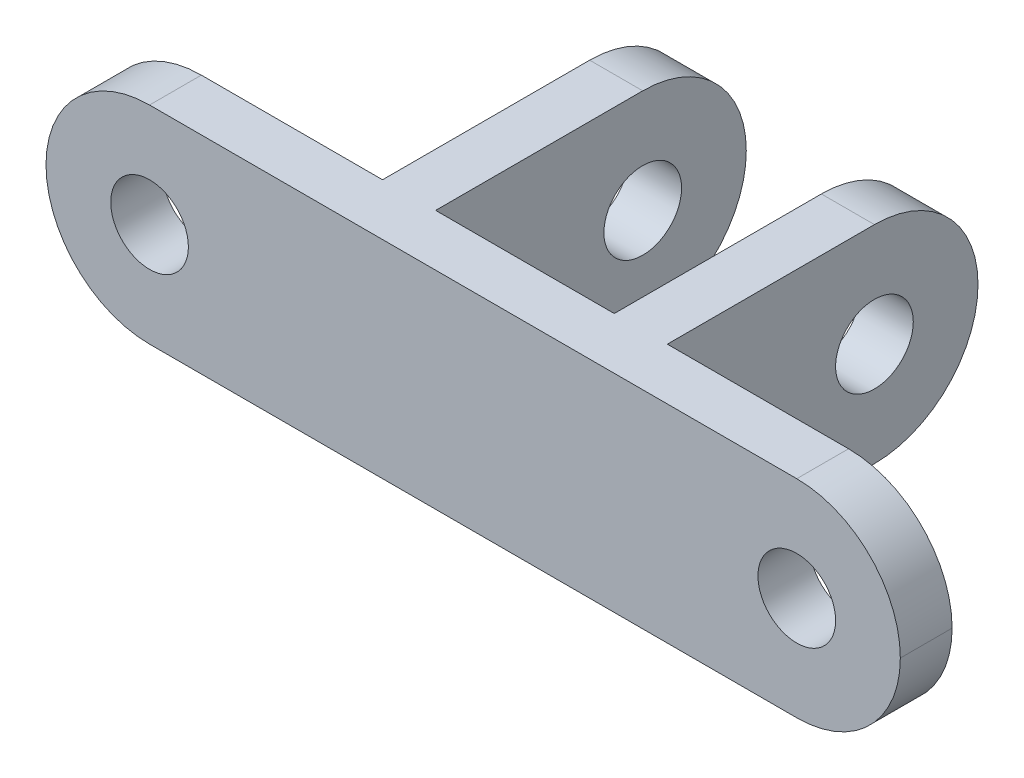
ISO-10303-21;
HEADER;
FILE_DESCRIPTION(('STEP AP214'),'2;1');
FILE_NAME('part.step','',(''),(''),'','','');
FILE_SCHEMA(('AUTOMOTIVE_DESIGN { 1 0 10303 214 1 1 1 1 }'));
ENDSEC;
DATA;
#1=APPLICATION_CONTEXT('core data for automotive mechanical design processes');
#2=APPLICATION_PROTOCOL_DEFINITION('international standard','automotive_design',2000,#1);
#3=PRODUCT_CONTEXT('',#1,'mechanical');
#4=PRODUCT('Part','Part','',(#3));
#5=PRODUCT_RELATED_PRODUCT_CATEGORY('part','',(#4));
#6=PRODUCT_DEFINITION_FORMATION('','',#4);
#7=PRODUCT_DEFINITION_CONTEXT('part definition',#1,'design');
#8=PRODUCT_DEFINITION('design','',#6,#7);
#9=PRODUCT_DEFINITION_SHAPE('','',#8);
#10=(LENGTH_UNIT() NAMED_UNIT(*) SI_UNIT(.MILLI.,.METRE.));
#11=(NAMED_UNIT(*) PLANE_ANGLE_UNIT() SI_UNIT($,.RADIAN.));
#12=(NAMED_UNIT(*) SI_UNIT($,.STERADIAN.) SOLID_ANGLE_UNIT());
#13=UNCERTAINTY_MEASURE_WITH_UNIT(LENGTH_MEASURE(1.E-05),#10,'distance_accuracy_value','');
#14=(GEOMETRIC_REPRESENTATION_CONTEXT(3) GLOBAL_UNCERTAINTY_ASSIGNED_CONTEXT((#13)) GLOBAL_UNIT_ASSIGNED_CONTEXT((#10,
#11,#12)) REPRESENTATION_CONTEXT('',''));
#15=CARTESIAN_POINT('',(0.,0.,0.));
#16=DIRECTION('',(0.,0.,1.));
#17=DIRECTION('',(1.,0.,0.));
#18=AXIS2_PLACEMENT_3D('',#15,#16,#17);
#19=CARTESIAN_POINT('',(-16.5,8.,7.));
#20=DIRECTION('',(0.,0.,-1.));
#21=DIRECTION('',(-1.,0.,0.));
#22=AXIS2_PLACEMENT_3D('',#19,#20,#21);
#23=PLANE('',#22);
#24=CARTESIAN_POINT('',(-12.5,4.,7.));
#25=DIRECTION('',(0.,0.,1.));
#26=DIRECTION('',(1.,0.,0.));
#27=AXIS2_PLACEMENT_3D('',#24,#25,#26);
#28=CIRCLE('',#27,1.5);
#29=CARTESIAN_POINT('',(-11.,4.,7.));
#30=VERTEX_POINT('',#29);
#31=EDGE_CURVE('E288',#30,#30,#28,.T.);
#32=ORIENTED_EDGE('',*,*,#31,.F.);
#33=EDGE_LOOP('',(#32));
#34=FACE_BOUND('',#33,.T.);
#35=CARTESIAN_POINT('',(12.5,4.,7.));
#36=DIRECTION('',(0.,0.,1.));
#37=DIRECTION('',(1.,0.,0.));
#38=AXIS2_PLACEMENT_3D('',#35,#36,#37);
#39=CIRCLE('',#38,1.5);
#40=CARTESIAN_POINT('',(14.,4.,7.));
#41=VERTEX_POINT('',#40);
#42=EDGE_CURVE('E277',#41,#41,#39,.T.);
#43=ORIENTED_EDGE('',*,*,#42,.F.);
#44=EDGE_LOOP('',(#43));
#45=FACE_BOUND('',#44,.T.);
#46=DIRECTION('',(1.,0.,0.));
#47=VECTOR('',#46,1.);
#48=CARTESIAN_POINT('',(-16.5,0.,7.));
#49=LINE('',#48,#47);
#50=CARTESIAN_POINT('',(-12.5,0.,7.));
#51=VERTEX_POINT('',#50);
#52=CARTESIAN_POINT('',(12.5,0.,7.));
#53=VERTEX_POINT('',#52);
#54=EDGE_CURVE('E211',#51,#53,#49,.T.);
#55=ORIENTED_EDGE('',*,*,#54,.T.);
#56=CARTESIAN_POINT('',(12.5,4.,7.));
#57=DIRECTION('',(0.,0.,-1.));
#58=DIRECTION('',(-1.,0.,0.));
#59=AXIS2_PLACEMENT_3D('',#56,#57,#58);
#60=CIRCLE('',#59,4.);
#61=CARTESIAN_POINT('',(16.5,4.,7.));
#62=VERTEX_POINT('',#61);
#63=EDGE_CURVE('E232',#53,#62,#60,.F.);
#64=ORIENTED_EDGE('',*,*,#63,.T.);
#65=CARTESIAN_POINT('',(12.5,4.,7.));
#66=DIRECTION('',(0.,0.,-1.));
#67=DIRECTION('',(-1.,0.,0.));
#68=AXIS2_PLACEMENT_3D('',#65,#66,#67);
#69=CIRCLE('',#68,4.);
#70=CARTESIAN_POINT('',(12.5,8.,7.));
#71=VERTEX_POINT('',#70);
#72=EDGE_CURVE('E230',#62,#71,#69,.F.);
#73=ORIENTED_EDGE('',*,*,#72,.T.);
#74=DIRECTION('',(1.,0.,0.));
#75=VECTOR('',#74,1.);
#76=CARTESIAN_POINT('',(-16.5,8.,7.));
#77=LINE('',#76,#75);
#78=CARTESIAN_POINT('',(-12.5,8.,7.));
#79=VERTEX_POINT('',#78);
#80=EDGE_CURVE('E212',#79,#71,#77,.T.);
#81=ORIENTED_EDGE('',*,*,#80,.F.);
#82=CARTESIAN_POINT('',(-12.5,4.,7.));
#83=DIRECTION('',(0.,0.,-1.));
#84=DIRECTION('',(-1.,0.,0.));
#85=AXIS2_PLACEMENT_3D('',#82,#83,#84);
#86=CIRCLE('',#85,4.);
#87=CARTESIAN_POINT('',(-16.5,4.,7.));
#88=VERTEX_POINT('',#87);
#89=EDGE_CURVE('E226',#79,#88,#86,.F.);
#90=ORIENTED_EDGE('',*,*,#89,.T.);
#91=CARTESIAN_POINT('',(-12.5,4.,7.));
#92=DIRECTION('',(0.,0.,-1.));
#93=DIRECTION('',(-1.,0.,0.));
#94=AXIS2_PLACEMENT_3D('',#91,#92,#93);
#95=CIRCLE('',#94,4.);
#96=EDGE_CURVE('E228',#88,#51,#95,.F.);
#97=ORIENTED_EDGE('',*,*,#96,.T.);
#98=EDGE_LOOP('',(#55,#64,#73,#81,#90,#97));
#99=FACE_BOUND('',#98,.T.);
#100=ADVANCED_FACE('F37',(#34,#45,#99),#23,.F.);
#101=CARTESIAN_POINT('',(0.,8.,0.));
#102=DIRECTION('',(0.,1.,0.));
#103=DIRECTION('',(0.,0.,1.));
#104=AXIS2_PLACEMENT_3D('',#101,#102,#103);
#105=PLANE('',#104);
#106=DIRECTION('',(0.,0.,1.));
#107=VECTOR('',#106,1.);
#108=CARTESIAN_POINT('',(-3.45000000000001,8.,-7.));
#109=LINE('',#108,#107);
#110=CARTESIAN_POINT('',(-3.45,8.,-3.));
#111=VERTEX_POINT('',#110);
#112=CARTESIAN_POINT('',(-3.45,8.,5.));
#113=VERTEX_POINT('',#112);
#114=EDGE_CURVE('E191',#111,#113,#109,.T.);
#115=ORIENTED_EDGE('',*,*,#114,.F.);
#116=DIRECTION('',(-1.,0.,0.));
#117=VECTOR('',#116,1.);
#118=CARTESIAN_POINT('',(-5.50000000000001,8.,-3.));
#119=LINE('',#118,#117);
#120=CARTESIAN_POINT('',(-5.5,8.,-3.));
#121=VERTEX_POINT('',#120);
#122=EDGE_CURVE('E249',#111,#121,#119,.T.);
#123=ORIENTED_EDGE('',*,*,#122,.T.);
#124=DIRECTION('',(0.,0.,-1.));
#125=VECTOR('',#124,1.);
#126=CARTESIAN_POINT('',(-5.50000000000001,8.,-7.));
#127=LINE('',#126,#125);
#128=CARTESIAN_POINT('',(-5.5,8.,5.));
#129=VERTEX_POINT('',#128);
#130=EDGE_CURVE('E202',#129,#121,#127,.T.);
#131=ORIENTED_EDGE('',*,*,#130,.F.);
#132=DIRECTION('',(1.,0.,0.));
#133=VECTOR('',#132,1.);
#134=CARTESIAN_POINT('',(-16.5,8.,5.));
#135=LINE('',#134,#133);
#136=CARTESIAN_POINT('',(-12.5,8.,5.));
#137=VERTEX_POINT('',#136);
#138=EDGE_CURVE('E167',#137,#129,#135,.T.);
#139=ORIENTED_EDGE('',*,*,#138,.F.);
#140=DIRECTION('',(0.,0.,1.));
#141=VECTOR('',#140,1.);
#142=CARTESIAN_POINT('',(-12.5,8.,7.));
#143=LINE('',#142,#141);
#144=EDGE_CURVE('E234',#137,#79,#143,.T.);
#145=ORIENTED_EDGE('',*,*,#144,.T.);
#146=ORIENTED_EDGE('',*,*,#80,.T.);
#147=DIRECTION('',(0.,0.,-1.));
#148=VECTOR('',#147,1.);
#149=CARTESIAN_POINT('',(12.5,8.,5.));
#150=LINE('',#149,#148);
#151=CARTESIAN_POINT('',(12.5,8.,5.));
#152=VERTEX_POINT('',#151);
#153=EDGE_CURVE('E173',#71,#152,#150,.T.);
#154=ORIENTED_EDGE('',*,*,#153,.T.);
#155=DIRECTION('',(1.,0.,0.));
#156=VECTOR('',#155,1.);
#157=CARTESIAN_POINT('',(16.5,8.,5.));
#158=LINE('',#157,#156);
#159=CARTESIAN_POINT('',(5.5,8.,5.));
#160=VERTEX_POINT('',#159);
#161=EDGE_CURVE('E157',#160,#152,#158,.T.);
#162=ORIENTED_EDGE('',*,*,#161,.F.);
#163=DIRECTION('',(0.,0.,1.));
#164=VECTOR('',#163,1.);
#165=CARTESIAN_POINT('',(5.5,8.,-7.));
#166=LINE('',#165,#164);
#167=CARTESIAN_POINT('',(5.5,8.,-3.));
#168=VERTEX_POINT('',#167);
#169=EDGE_CURVE('E150',#168,#160,#166,.T.);
#170=ORIENTED_EDGE('',*,*,#169,.F.);
#171=DIRECTION('',(-1.,0.,0.));
#172=VECTOR('',#171,1.);
#173=CARTESIAN_POINT('',(3.44999999999999,8.,-3.));
#174=LINE('',#173,#172);
#175=CARTESIAN_POINT('',(3.45,8.,-3.));
#176=VERTEX_POINT('',#175);
#177=EDGE_CURVE('E241',#168,#176,#174,.T.);
#178=ORIENTED_EDGE('',*,*,#177,.T.);
#179=DIRECTION('',(0.,0.,-1.));
#180=VECTOR('',#179,1.);
#181=CARTESIAN_POINT('',(3.44999999999999,8.,-7.));
#182=LINE('',#181,#180);
#183=CARTESIAN_POINT('',(3.45,8.,5.));
#184=VERTEX_POINT('',#183);
#185=EDGE_CURVE('E189',#184,#176,#182,.T.);
#186=ORIENTED_EDGE('',*,*,#185,.F.);
#187=DIRECTION('',(1.,0.,0.));
#188=VECTOR('',#187,1.);
#189=CARTESIAN_POINT('',(3.45,8.,5.));
#190=LINE('',#189,#188);
#191=EDGE_CURVE('E183',#113,#184,#190,.T.);
#192=ORIENTED_EDGE('',*,*,#191,.F.);
#193=EDGE_LOOP('',(#115,#123,#131,#139,#145,#146,#154,#162,#170,#178,#186,#192));
#194=FACE_BOUND('',#193,.T.);
#195=ADVANCED_FACE('F170',(#194),#105,.T.);
#196=CARTESIAN_POINT('',(0.,0.,0.));
#197=DIRECTION('',(0.,1.,0.));
#198=DIRECTION('',(0.,0.,1.));
#199=AXIS2_PLACEMENT_3D('',#196,#197,#198);
#200=PLANE('',#199);
#201=DIRECTION('',(0.,0.,-1.));
#202=VECTOR('',#201,1.);
#203=CARTESIAN_POINT('',(-5.50000000000001,0.,-7.));
#204=LINE('',#203,#202);
#205=CARTESIAN_POINT('',(-5.5,0.,5.));
#206=VERTEX_POINT('',#205);
#207=CARTESIAN_POINT('',(-5.5,0.,-3.));
#208=VERTEX_POINT('',#207);
#209=EDGE_CURVE('E201',#206,#208,#204,.T.);
#210=ORIENTED_EDGE('',*,*,#209,.T.);
#211=DIRECTION('',(-1.,0.,0.));
#212=VECTOR('',#211,1.);
#213=CARTESIAN_POINT('',(0.,0.,-3.));
#214=LINE('',#213,#212);
#215=CARTESIAN_POINT('',(-3.45,0.,-3.));
#216=VERTEX_POINT('',#215);
#217=EDGE_CURVE('E263',#208,#216,#214,.F.);
#218=ORIENTED_EDGE('',*,*,#217,.T.);
#219=DIRECTION('',(0.,0.,1.));
#220=VECTOR('',#219,1.);
#221=CARTESIAN_POINT('',(-3.45000000000001,0.,-7.));
#222=LINE('',#221,#220);
#223=CARTESIAN_POINT('',(-3.45,0.,5.));
#224=VERTEX_POINT('',#223);
#225=EDGE_CURVE('E182',#216,#224,#222,.T.);
#226=ORIENTED_EDGE('',*,*,#225,.T.);
#227=DIRECTION('',(1.,0.,0.));
#228=VECTOR('',#227,1.);
#229=CARTESIAN_POINT('',(3.45,0.,5.));
#230=LINE('',#229,#228);
#231=CARTESIAN_POINT('',(3.45,0.,5.));
#232=VERTEX_POINT('',#231);
#233=EDGE_CURVE('E185',#224,#232,#230,.T.);
#234=ORIENTED_EDGE('',*,*,#233,.T.);
#235=DIRECTION('',(0.,0.,-1.));
#236=VECTOR('',#235,1.);
#237=CARTESIAN_POINT('',(3.44999999999999,0.,-7.));
#238=LINE('',#237,#236);
#239=CARTESIAN_POINT('',(3.45,0.,-3.));
#240=VERTEX_POINT('',#239);
#241=EDGE_CURVE('E179',#232,#240,#238,.T.);
#242=ORIENTED_EDGE('',*,*,#241,.T.);
#243=DIRECTION('',(-1.,0.,0.));
#244=VECTOR('',#243,1.);
#245=CARTESIAN_POINT('',(0.,0.,-3.));
#246=LINE('',#245,#244);
#247=CARTESIAN_POINT('',(5.5,0.,-3.));
#248=VERTEX_POINT('',#247);
#249=EDGE_CURVE('E260',#240,#248,#246,.F.);
#250=ORIENTED_EDGE('',*,*,#249,.T.);
#251=DIRECTION('',(0.,0.,1.));
#252=VECTOR('',#251,1.);
#253=CARTESIAN_POINT('',(5.5,0.,-7.));
#254=LINE('',#253,#252);
#255=CARTESIAN_POINT('',(5.5,0.,5.));
#256=VERTEX_POINT('',#255);
#257=EDGE_CURVE('E174',#248,#256,#254,.T.);
#258=ORIENTED_EDGE('',*,*,#257,.T.);
#259=DIRECTION('',(1.,0.,0.));
#260=VECTOR('',#259,1.);
#261=CARTESIAN_POINT('',(16.5,0.,5.));
#262=LINE('',#261,#260);
#263=CARTESIAN_POINT('',(12.5,0.,5.));
#264=VERTEX_POINT('',#263);
#265=EDGE_CURVE('E166',#256,#264,#262,.T.);
#266=ORIENTED_EDGE('',*,*,#265,.T.);
#267=DIRECTION('',(0.,0.,-1.));
#268=VECTOR('',#267,1.);
#269=CARTESIAN_POINT('',(12.5,0.,0.));
#270=LINE('',#269,#268);
#271=EDGE_CURVE('E223',#264,#53,#270,.F.);
#272=ORIENTED_EDGE('',*,*,#271,.T.);
#273=ORIENTED_EDGE('',*,*,#54,.F.);
#274=DIRECTION('',(0.,0.,1.));
#275=VECTOR('',#274,1.);
#276=CARTESIAN_POINT('',(-12.5,0.,0.));
#277=LINE('',#276,#275);
#278=CARTESIAN_POINT('',(-12.5,0.,5.));
#279=VERTEX_POINT('',#278);
#280=EDGE_CURVE('E220',#51,#279,#277,.F.);
#281=ORIENTED_EDGE('',*,*,#280,.T.);
#282=DIRECTION('',(1.,0.,0.));
#283=VECTOR('',#282,1.);
#284=CARTESIAN_POINT('',(-16.5,0.,5.));
#285=LINE('',#284,#283);
#286=EDGE_CURVE('E199',#279,#206,#285,.T.);
#287=ORIENTED_EDGE('',*,*,#286,.T.);
#288=EDGE_LOOP('',(#210,#218,#226,#234,#242,#250,#258,#266,#272,#273,#281,#287));
#289=FACE_BOUND('',#288,.T.);
#290=ADVANCED_FACE('F299',(#289),#200,.F.);
#291=CARTESIAN_POINT('',(-5.50000000000001,0.,-7.));
#292=DIRECTION('',(1.,0.,0.));
#293=DIRECTION('',(0.,0.,-1.));
#294=AXIS2_PLACEMENT_3D('',#291,#292,#293);
#295=PLANE('',#294);
#296=CARTESIAN_POINT('',(-5.5,4.,-3.));
#297=DIRECTION('',(1.,0.,0.));
#298=DIRECTION('',(0.,0.,-1.));
#299=AXIS2_PLACEMENT_3D('',#296,#297,#298);
#300=CIRCLE('',#299,1.5);
#301=CARTESIAN_POINT('',(-5.5,4.,-4.5));
#302=VERTEX_POINT('',#301);
#303=EDGE_CURVE('E281',#302,#302,#300,.T.);
#304=ORIENTED_EDGE('',*,*,#303,.T.);
#305=EDGE_LOOP('',(#304));
#306=FACE_BOUND('',#305,.T.);
#307=ORIENTED_EDGE('',*,*,#130,.T.);
#308=CARTESIAN_POINT('',(-5.5,4.,-3.));
#309=DIRECTION('',(1.,0.,0.));
#310=DIRECTION('',(0.,0.,-1.));
#311=AXIS2_PLACEMENT_3D('',#308,#309,#310);
#312=CIRCLE('',#311,4.);
#313=CARTESIAN_POINT('',(-5.50000000000001,4.,-7.));
#314=VERTEX_POINT('',#313);
#315=EDGE_CURVE('E254',#121,#314,#312,.F.);
#316=ORIENTED_EDGE('',*,*,#315,.T.);
#317=CARTESIAN_POINT('',(-5.50000000000001,4.,-3.));
#318=DIRECTION('',(1.,0.,0.));
#319=DIRECTION('',(0.,0.,-1.));
#320=AXIS2_PLACEMENT_3D('',#317,#318,#319);
#321=CIRCLE('',#320,4.);
#322=EDGE_CURVE('E252',#314,#208,#321,.F.);
#323=ORIENTED_EDGE('',*,*,#322,.T.);
#324=ORIENTED_EDGE('',*,*,#209,.F.);
#325=DIRECTION('',(0.,1.,0.));
#326=VECTOR('',#325,1.);
#327=CARTESIAN_POINT('',(-5.5,0.,5.));
#328=LINE('',#327,#326);
#329=EDGE_CURVE('E205',#206,#129,#328,.T.);
#330=ORIENTED_EDGE('',*,*,#329,.T.);
#331=EDGE_LOOP('',(#307,#316,#323,#324,#330));
#332=FACE_BOUND('',#331,.T.);
#333=ADVANCED_FACE('F332',(#306,#332),#295,.F.);
#334=CARTESIAN_POINT('',(-16.5,0.,5.));
#335=DIRECTION('',(0.,0.,1.));
#336=DIRECTION('',(1.,0.,0.));
#337=AXIS2_PLACEMENT_3D('',#334,#335,#336);
#338=PLANE('',#337);
#339=CARTESIAN_POINT('',(-12.5,4.,5.));
#340=DIRECTION('',(0.,0.,1.));
#341=DIRECTION('',(1.,0.,0.));
#342=AXIS2_PLACEMENT_3D('',#339,#340,#341);
#343=CIRCLE('',#342,1.5);
#344=CARTESIAN_POINT('',(-11.,4.,5.));
#345=VERTEX_POINT('',#344);
#346=EDGE_CURVE('E41',#345,#345,#343,.T.);
#347=ORIENTED_EDGE('',*,*,#346,.T.);
#348=EDGE_LOOP('',(#347));
#349=FACE_BOUND('',#348,.T.);
#350=ORIENTED_EDGE('',*,*,#286,.F.);
#351=CARTESIAN_POINT('',(-12.5,4.,5.));
#352=DIRECTION('',(0.,0.,1.));
#353=DIRECTION('',(1.,0.,0.));
#354=AXIS2_PLACEMENT_3D('',#351,#352,#353);
#355=CIRCLE('',#354,4.);
#356=CARTESIAN_POINT('',(-16.5,4.,5.));
#357=VERTEX_POINT('',#356);
#358=EDGE_CURVE('E239',#279,#357,#355,.F.);
#359=ORIENTED_EDGE('',*,*,#358,.T.);
#360=CARTESIAN_POINT('',(-12.5,4.,5.));
#361=DIRECTION('',(0.,0.,1.));
#362=DIRECTION('',(1.,0.,0.));
#363=AXIS2_PLACEMENT_3D('',#360,#361,#362);
#364=CIRCLE('',#363,4.);
#365=EDGE_CURVE('E237',#357,#137,#364,.F.);
#366=ORIENTED_EDGE('',*,*,#365,.T.);
#367=ORIENTED_EDGE('',*,*,#138,.T.);
#368=ORIENTED_EDGE('',*,*,#329,.F.);
#369=EDGE_LOOP('',(#350,#359,#366,#367,#368));
#370=FACE_BOUND('',#369,.T.);
#371=ADVANCED_FACE('F334',(#349,#370),#338,.F.);
#372=CARTESIAN_POINT('',(3.44999999999999,0.,-7.));
#373=DIRECTION('',(1.,0.,0.));
#374=DIRECTION('',(0.,0.,-1.));
#375=AXIS2_PLACEMENT_3D('',#372,#373,#374);
#376=PLANE('',#375);
#377=CARTESIAN_POINT('',(3.44999999999999,4.,-3.));
#378=DIRECTION('',(1.,0.,0.));
#379=DIRECTION('',(0.,0.,-1.));
#380=AXIS2_PLACEMENT_3D('',#377,#378,#379);
#381=CIRCLE('',#380,1.5);
#382=CARTESIAN_POINT('',(3.44999999999999,4.,-4.5));
#383=VERTEX_POINT('',#382);
#384=EDGE_CURVE('E273',#383,#383,#381,.T.);
#385=ORIENTED_EDGE('',*,*,#384,.T.);
#386=EDGE_LOOP('',(#385));
#387=FACE_BOUND('',#386,.T.);
#388=CARTESIAN_POINT('',(3.45,4.,-3.));
#389=DIRECTION('',(1.,0.,0.));
#390=DIRECTION('',(0.,0.,-1.));
#391=AXIS2_PLACEMENT_3D('',#388,#389,#390);
#392=CIRCLE('',#391,4.);
#393=CARTESIAN_POINT('',(3.44999999999999,4.,-7.));
#394=VERTEX_POINT('',#393);
#395=EDGE_CURVE('E60',#176,#394,#392,.F.);
#396=ORIENTED_EDGE('',*,*,#395,.T.);
#397=CARTESIAN_POINT('',(3.44999999999999,4.,-3.));
#398=DIRECTION('',(1.,0.,0.));
#399=DIRECTION('',(0.,0.,-1.));
#400=AXIS2_PLACEMENT_3D('',#397,#398,#399);
#401=CIRCLE('',#400,4.);
#402=EDGE_CURVE('E266',#394,#240,#401,.F.);
#403=ORIENTED_EDGE('',*,*,#402,.T.);
#404=ORIENTED_EDGE('',*,*,#241,.F.);
#405=DIRECTION('',(0.,1.,0.));
#406=VECTOR('',#405,1.);
#407=CARTESIAN_POINT('',(3.45,0.,5.));
#408=LINE('',#407,#406);
#409=EDGE_CURVE('E158',#232,#184,#408,.T.);
#410=ORIENTED_EDGE('',*,*,#409,.T.);
#411=ORIENTED_EDGE('',*,*,#185,.T.);
#412=EDGE_LOOP('',(#396,#403,#404,#410,#411));
#413=FACE_BOUND('',#412,.T.);
#414=ADVANCED_FACE('F337',(#387,#413),#376,.F.);
#415=CARTESIAN_POINT('',(3.45,0.,5.));
#416=DIRECTION('',(0.,0.,1.));
#417=DIRECTION('',(1.,0.,0.));
#418=AXIS2_PLACEMENT_3D('',#415,#416,#417);
#419=PLANE('',#418);
#420=ORIENTED_EDGE('',*,*,#191,.T.);
#421=ORIENTED_EDGE('',*,*,#409,.F.);
#422=ORIENTED_EDGE('',*,*,#233,.F.);
#423=DIRECTION('',(0.,1.,0.));
#424=VECTOR('',#423,1.);
#425=CARTESIAN_POINT('',(-3.45,0.,5.));
#426=LINE('',#425,#424);
#427=EDGE_CURVE('E188',#224,#113,#426,.T.);
#428=ORIENTED_EDGE('',*,*,#427,.T.);
#429=EDGE_LOOP('',(#420,#421,#422,#428));
#430=FACE_BOUND('',#429,.T.);
#431=ADVANCED_FACE('F344',(#430),#419,.F.);
#432=CARTESIAN_POINT('',(-3.45000000000001,0.,-7.));
#433=DIRECTION('',(-1.,0.,0.));
#434=DIRECTION('',(0.,0.,1.));
#435=AXIS2_PLACEMENT_3D('',#432,#433,#434);
#436=PLANE('',#435);
#437=CARTESIAN_POINT('',(-3.45,4.,-3.));
#438=DIRECTION('',(-1.,0.,0.));
#439=DIRECTION('',(0.,0.,1.));
#440=AXIS2_PLACEMENT_3D('',#437,#438,#439);
#441=CIRCLE('',#440,1.5);
#442=CARTESIAN_POINT('',(-3.45,4.,-1.5));
#443=VERTEX_POINT('',#442);
#444=EDGE_CURVE('E292',#443,#443,#441,.T.);
#445=ORIENTED_EDGE('',*,*,#444,.T.);
#446=EDGE_LOOP('',(#445));
#447=FACE_BOUND('',#446,.T.);
#448=CARTESIAN_POINT('',(-3.45000000000001,4.,-3.));
#449=DIRECTION('',(-1.,0.,0.));
#450=DIRECTION('',(0.,0.,1.));
#451=AXIS2_PLACEMENT_3D('',#448,#449,#450);
#452=CIRCLE('',#451,4.);
#453=CARTESIAN_POINT('',(-3.45000000000001,4.,-7.));
#454=VERTEX_POINT('',#453);
#455=EDGE_CURVE('E256',#216,#454,#452,.F.);
#456=ORIENTED_EDGE('',*,*,#455,.T.);
#457=CARTESIAN_POINT('',(-3.45,4.,-3.));
#458=DIRECTION('',(-1.,0.,0.));
#459=DIRECTION('',(0.,0.,1.));
#460=AXIS2_PLACEMENT_3D('',#457,#458,#459);
#461=CIRCLE('',#460,4.);
#462=EDGE_CURVE('E258',#454,#111,#461,.F.);
#463=ORIENTED_EDGE('',*,*,#462,.T.);
#464=ORIENTED_EDGE('',*,*,#114,.T.);
#465=ORIENTED_EDGE('',*,*,#427,.F.);
#466=ORIENTED_EDGE('',*,*,#225,.F.);
#467=EDGE_LOOP('',(#456,#463,#464,#465,#466));
#468=FACE_BOUND('',#467,.T.);
#469=ADVANCED_FACE('F346',(#447,#468),#436,.F.);
#470=CARTESIAN_POINT('',(16.5,0.,5.));
#471=DIRECTION('',(0.,0.,1.));
#472=DIRECTION('',(1.,0.,0.));
#473=AXIS2_PLACEMENT_3D('',#470,#471,#472);
#474=PLANE('',#473);
#475=CARTESIAN_POINT('',(12.5,4.,5.));
#476=DIRECTION('',(0.,0.,1.));
#477=DIRECTION('',(1.,0.,0.));
#478=AXIS2_PLACEMENT_3D('',#475,#476,#477);
#479=CIRCLE('',#478,1.5);
#480=CARTESIAN_POINT('',(14.,4.,5.));
#481=VERTEX_POINT('',#480);
#482=EDGE_CURVE('E274',#481,#481,#479,.T.);
#483=ORIENTED_EDGE('',*,*,#482,.T.);
#484=EDGE_LOOP('',(#483));
#485=FACE_BOUND('',#484,.T.);
#486=CARTESIAN_POINT('',(12.5,4.,5.));
#487=DIRECTION('',(0.,0.,1.));
#488=DIRECTION('',(1.,0.,0.));
#489=AXIS2_PLACEMENT_3D('',#486,#487,#488);
#490=CIRCLE('',#489,4.);
#491=CARTESIAN_POINT('',(16.5,4.,5.));
#492=VERTEX_POINT('',#491);
#493=EDGE_CURVE('E214',#152,#492,#490,.F.);
#494=ORIENTED_EDGE('',*,*,#493,.T.);
#495=CARTESIAN_POINT('',(12.5,4.,5.));
#496=DIRECTION('',(0.,0.,1.));
#497=DIRECTION('',(1.,0.,0.));
#498=AXIS2_PLACEMENT_3D('',#495,#496,#497);
#499=CIRCLE('',#498,4.);
#500=EDGE_CURVE('E218',#492,#264,#499,.F.);
#501=ORIENTED_EDGE('',*,*,#500,.T.);
#502=ORIENTED_EDGE('',*,*,#265,.F.);
#503=DIRECTION('',(0.,1.,0.));
#504=VECTOR('',#503,1.);
#505=CARTESIAN_POINT('',(5.5,0.,5.));
#506=LINE('',#505,#504);
#507=EDGE_CURVE('E153',#256,#160,#506,.T.);
#508=ORIENTED_EDGE('',*,*,#507,.T.);
#509=ORIENTED_EDGE('',*,*,#161,.T.);
#510=EDGE_LOOP('',(#494,#501,#502,#508,#509));
#511=FACE_BOUND('',#510,.T.);
#512=ADVANCED_FACE('F163',(#485,#511),#474,.F.);
#513=CARTESIAN_POINT('',(5.5,0.,-7.));
#514=DIRECTION('',(-1.,0.,0.));
#515=DIRECTION('',(0.,0.,1.));
#516=AXIS2_PLACEMENT_3D('',#513,#514,#515);
#517=PLANE('',#516);
#518=CARTESIAN_POINT('',(5.5,4.,-3.));
#519=DIRECTION('',(1.,0.,0.));
#520=DIRECTION('',(0.,0.,-1.));
#521=AXIS2_PLACEMENT_3D('',#518,#519,#520);
#522=CIRCLE('',#521,1.5);
#523=CARTESIAN_POINT('',(5.5,4.,-4.5));
#524=VERTEX_POINT('',#523);
#525=EDGE_CURVE('E276',#524,#524,#522,.T.);
#526=ORIENTED_EDGE('',*,*,#525,.F.);
#527=EDGE_LOOP('',(#526));
#528=FACE_BOUND('',#527,.T.);
#529=ORIENTED_EDGE('',*,*,#257,.F.);
#530=CARTESIAN_POINT('',(5.5,4.,-3.));
#531=DIRECTION('',(-1.,0.,0.));
#532=DIRECTION('',(0.,0.,1.));
#533=AXIS2_PLACEMENT_3D('',#530,#531,#532);
#534=CIRCLE('',#533,4.);
#535=CARTESIAN_POINT('',(5.5,4.,-7.));
#536=VERTEX_POINT('',#535);
#537=EDGE_CURVE('E11',#248,#536,#534,.F.);
#538=ORIENTED_EDGE('',*,*,#537,.T.);
#539=CARTESIAN_POINT('',(5.5,4.,-3.));
#540=DIRECTION('',(-1.,0.,0.));
#541=DIRECTION('',(0.,0.,1.));
#542=AXIS2_PLACEMENT_3D('',#539,#540,#541);
#543=CIRCLE('',#542,4.);
#544=EDGE_CURVE('E46',#536,#168,#543,.F.);
#545=ORIENTED_EDGE('',*,*,#544,.T.);
#546=ORIENTED_EDGE('',*,*,#169,.T.);
#547=ORIENTED_EDGE('',*,*,#507,.F.);
#548=EDGE_LOOP('',(#529,#538,#545,#546,#547));
#549=FACE_BOUND('',#548,.T.);
#550=ADVANCED_FACE('F152',(#528,#549),#517,.F.);
#551=CARTESIAN_POINT('',(12.5,4.,0.));
#552=DIRECTION('',(0.,0.,1.));
#553=DIRECTION('',(1.,0.,0.));
#554=AXIS2_PLACEMENT_3D('',#551,#552,#553);
#555=CYLINDRICAL_SURFACE('',#554,4.);
#556=ORIENTED_EDGE('',*,*,#153,.F.);
#557=ORIENTED_EDGE('',*,*,#72,.F.);
#558=DIRECTION('',(0.,0.,-1.));
#559=VECTOR('',#558,1.);
#560=CARTESIAN_POINT('',(16.5,4.,7.));
#561=LINE('',#560,#559);
#562=EDGE_CURVE('E192',#492,#62,#561,.F.);
#563=ORIENTED_EDGE('',*,*,#562,.F.);
#564=ORIENTED_EDGE('',*,*,#493,.F.);
#565=EDGE_LOOP('',(#556,#557,#563,#564));
#566=FACE_BOUND('',#565,.T.);
#567=ADVANCED_FACE('F309',(#566),#555,.T.);
#568=CARTESIAN_POINT('',(12.5,4.,-7.));
#569=DIRECTION('',(0.,0.,-1.));
#570=DIRECTION('',(-1.,0.,0.));
#571=AXIS2_PLACEMENT_3D('',#568,#569,#570);
#572=CYLINDRICAL_SURFACE('',#571,4.);
#573=ORIENTED_EDGE('',*,*,#63,.F.);
#574=ORIENTED_EDGE('',*,*,#271,.F.);
#575=ORIENTED_EDGE('',*,*,#500,.F.);
#576=ORIENTED_EDGE('',*,*,#562,.T.);
#577=EDGE_LOOP('',(#573,#574,#575,#576));
#578=FACE_BOUND('',#577,.T.);
#579=ADVANCED_FACE('F303',(#578),#572,.T.);
#580=CARTESIAN_POINT('',(-12.5,4.,0.));
#581=DIRECTION('',(0.,0.,-1.));
#582=DIRECTION('',(-1.,0.,0.));
#583=AXIS2_PLACEMENT_3D('',#580,#581,#582);
#584=CYLINDRICAL_SURFACE('',#583,4.);
#585=ORIENTED_EDGE('',*,*,#144,.F.);
#586=ORIENTED_EDGE('',*,*,#365,.F.);
#587=DIRECTION('',(0.,0.,1.));
#588=VECTOR('',#587,1.);
#589=CARTESIAN_POINT('',(-16.5,4.,5.));
#590=LINE('',#589,#588);
#591=EDGE_CURVE('E244',#88,#357,#590,.F.);
#592=ORIENTED_EDGE('',*,*,#591,.F.);
#593=ORIENTED_EDGE('',*,*,#89,.F.);
#594=EDGE_LOOP('',(#585,#586,#592,#593));
#595=FACE_BOUND('',#594,.T.);
#596=ADVANCED_FACE('F316',(#595),#584,.T.);
#597=CARTESIAN_POINT('',(-12.5,4.,-7.));
#598=DIRECTION('',(0.,0.,1.));
#599=DIRECTION('',(1.,0.,0.));
#600=AXIS2_PLACEMENT_3D('',#597,#598,#599);
#601=CYLINDRICAL_SURFACE('',#600,4.);
#602=ORIENTED_EDGE('',*,*,#358,.F.);
#603=ORIENTED_EDGE('',*,*,#280,.F.);
#604=ORIENTED_EDGE('',*,*,#96,.F.);
#605=ORIENTED_EDGE('',*,*,#591,.T.);
#606=EDGE_LOOP('',(#602,#603,#604,#605));
#607=FACE_BOUND('',#606,.T.);
#608=ADVANCED_FACE('F410',(#607),#601,.T.);
#609=CARTESIAN_POINT('',(-16.5,4.,-3.));
#610=DIRECTION('',(-1.,0.,0.));
#611=DIRECTION('',(0.,0.,1.));
#612=AXIS2_PLACEMENT_3D('',#609,#610,#611);
#613=CYLINDRICAL_SURFACE('',#612,4.);
#614=DIRECTION('',(-1.,0.,0.));
#615=VECTOR('',#614,1.);
#616=CARTESIAN_POINT('',(-16.5,4.,-7.));
#617=LINE('',#616,#615);
#618=EDGE_CURVE('E247',#454,#314,#617,.T.);
#619=ORIENTED_EDGE('',*,*,#618,.F.);
#620=ORIENTED_EDGE('',*,*,#455,.F.);
#621=ORIENTED_EDGE('',*,*,#217,.F.);
#622=ORIENTED_EDGE('',*,*,#322,.F.);
#623=EDGE_LOOP('',(#619,#620,#621,#622));
#624=FACE_BOUND('',#623,.T.);
#625=ADVANCED_FACE('F384',(#624),#613,.T.);
#626=CARTESIAN_POINT('',(0.,4.,-3.));
#627=DIRECTION('',(1.,0.,0.));
#628=DIRECTION('',(0.,0.,-1.));
#629=AXIS2_PLACEMENT_3D('',#626,#627,#628);
#630=CYLINDRICAL_SURFACE('',#629,4.);
#631=ORIENTED_EDGE('',*,*,#462,.F.);
#632=ORIENTED_EDGE('',*,*,#618,.T.);
#633=ORIENTED_EDGE('',*,*,#315,.F.);
#634=ORIENTED_EDGE('',*,*,#122,.F.);
#635=EDGE_LOOP('',(#631,#632,#633,#634));
#636=FACE_BOUND('',#635,.T.);
#637=ADVANCED_FACE('F388',(#636),#630,.T.);
#638=CARTESIAN_POINT('',(0.,4.,-3.));
#639=DIRECTION('',(1.,0.,0.));
#640=DIRECTION('',(0.,0.,-1.));
#641=AXIS2_PLACEMENT_3D('',#638,#639,#640);
#642=CYLINDRICAL_SURFACE('',#641,4.);
#643=ORIENTED_EDGE('',*,*,#177,.F.);
#644=ORIENTED_EDGE('',*,*,#544,.F.);
#645=DIRECTION('',(-1.,0.,0.));
#646=VECTOR('',#645,1.);
#647=CARTESIAN_POINT('',(5.5,4.,-7.));
#648=LINE('',#647,#646);
#649=EDGE_CURVE('E271',#394,#536,#648,.F.);
#650=ORIENTED_EDGE('',*,*,#649,.F.);
#651=ORIENTED_EDGE('',*,*,#395,.F.);
#652=EDGE_LOOP('',(#643,#644,#650,#651));
#653=FACE_BOUND('',#652,.T.);
#654=ADVANCED_FACE('F39',(#653),#642,.T.);
#655=CARTESIAN_POINT('',(-16.5,4.,-3.));
#656=DIRECTION('',(-1.,0.,0.));
#657=DIRECTION('',(0.,0.,1.));
#658=AXIS2_PLACEMENT_3D('',#655,#656,#657);
#659=CYLINDRICAL_SURFACE('',#658,4.);
#660=ORIENTED_EDGE('',*,*,#537,.F.);
#661=ORIENTED_EDGE('',*,*,#249,.F.);
#662=ORIENTED_EDGE('',*,*,#402,.F.);
#663=ORIENTED_EDGE('',*,*,#649,.T.);
#664=EDGE_LOOP('',(#660,#661,#662,#663));
#665=FACE_BOUND('',#664,.T.);
#666=ADVANCED_FACE('F359',(#665),#659,.T.);
#667=CARTESIAN_POINT('',(-5.5,4.,-3.));
#668=DIRECTION('',(1.,0.,0.));
#669=DIRECTION('',(0.,0.,-1.));
#670=AXIS2_PLACEMENT_3D('',#667,#668,#669);
#671=CYLINDRICAL_SURFACE('',#670,1.5);
#672=ORIENTED_EDGE('',*,*,#525,.T.);
#673=EDGE_LOOP('',(#672));
#674=FACE_BOUND('',#673,.T.);
#675=ORIENTED_EDGE('',*,*,#384,.F.);
#676=EDGE_LOOP('',(#675));
#677=FACE_BOUND('',#676,.T.);
#678=ADVANCED_FACE('F355',(#674,#677),#671,.F.);
#679=ORIENTED_EDGE('',*,*,#303,.F.);
#680=EDGE_LOOP('',(#679));
#681=FACE_BOUND('',#680,.T.);
#682=ORIENTED_EDGE('',*,*,#444,.F.);
#683=EDGE_LOOP('',(#682));
#684=FACE_BOUND('',#683,.T.);
#685=ADVANCED_FACE('F358',(#681,#684),#671,.F.);
#686=CARTESIAN_POINT('',(12.5,4.,-7.));
#687=DIRECTION('',(0.,0.,1.));
#688=DIRECTION('',(1.,0.,0.));
#689=AXIS2_PLACEMENT_3D('',#686,#687,#688);
#690=CYLINDRICAL_SURFACE('',#689,1.5);
#691=ORIENTED_EDGE('',*,*,#42,.T.);
#692=EDGE_LOOP('',(#691));
#693=FACE_BOUND('',#692,.T.);
#694=ORIENTED_EDGE('',*,*,#482,.F.);
#695=EDGE_LOOP('',(#694));
#696=FACE_BOUND('',#695,.T.);
#697=ADVANCED_FACE('F361',(#693,#696),#690,.F.);
#698=CARTESIAN_POINT('',(-12.5,4.,-7.));
#699=DIRECTION('',(0.,0.,1.));
#700=DIRECTION('',(1.,0.,0.));
#701=AXIS2_PLACEMENT_3D('',#698,#699,#700);
#702=CYLINDRICAL_SURFACE('',#701,1.5);
#703=ORIENTED_EDGE('',*,*,#31,.T.);
#704=EDGE_LOOP('',(#703));
#705=FACE_BOUND('',#704,.T.);
#706=ORIENTED_EDGE('',*,*,#346,.F.);
#707=EDGE_LOOP('',(#706));
#708=FACE_BOUND('',#707,.T.);
#709=ADVANCED_FACE('F364',(#705,#708),#702,.F.);
#710=CLOSED_SHELL('',(#100,#195,#290,#333,#371,#414,#431,#469,#512,#550,#567,#579,#596,#608,
#625,#637,#654,#666,#678,#685,#697,#709));
#711=MANIFOLD_SOLID_BREP('B2',#710);
#712=ADVANCED_BREP_SHAPE_REPRESENTATION('',(#18,#711),#14);
#713=SHAPE_DEFINITION_REPRESENTATION(#9,#712);
ENDSEC;
END-ISO-10303-21;
